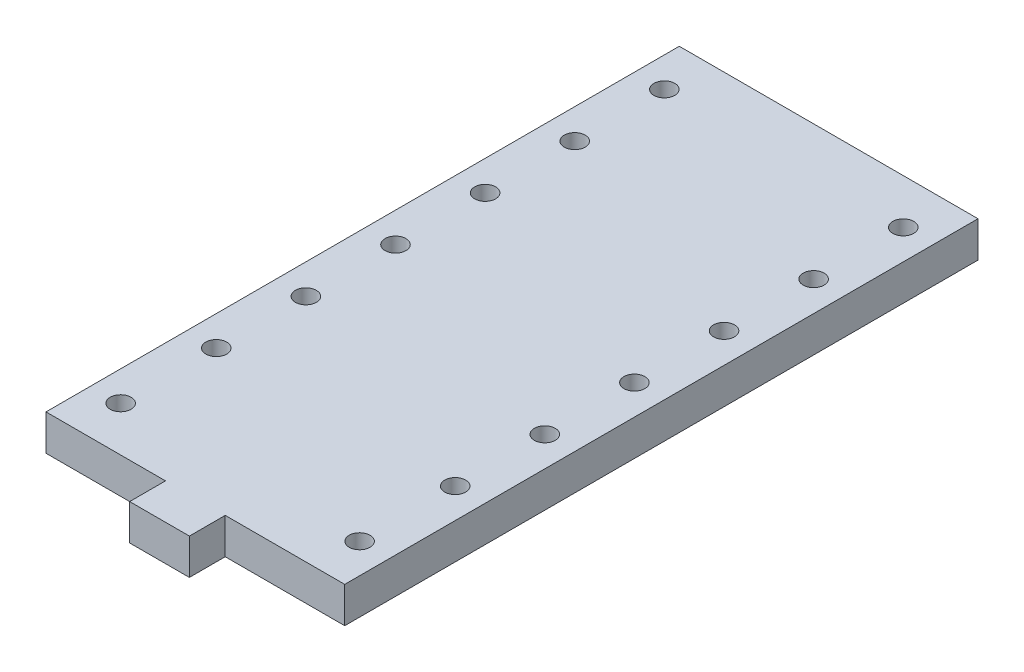
ISO-10303-21;
HEADER;
FILE_DESCRIPTION(('STEP AP214'),'2;1');
FILE_NAME('part.step','',(''),(''),'','','');
FILE_SCHEMA(('AUTOMOTIVE_DESIGN { 1 0 10303 214 1 1 1 1 }'));
ENDSEC;
DATA;
#1=APPLICATION_CONTEXT('core data for automotive mechanical design processes');
#2=APPLICATION_PROTOCOL_DEFINITION('international standard','automotive_design',2000,#1);
#3=PRODUCT_CONTEXT('',#1,'mechanical');
#4=PRODUCT('Part','Part','',(#3));
#5=PRODUCT_RELATED_PRODUCT_CATEGORY('part','',(#4));
#6=PRODUCT_DEFINITION_FORMATION('','',#4);
#7=PRODUCT_DEFINITION_CONTEXT('part definition',#1,'design');
#8=PRODUCT_DEFINITION('design','',#6,#7);
#9=PRODUCT_DEFINITION_SHAPE('','',#8);
#10=(LENGTH_UNIT() NAMED_UNIT(*) SI_UNIT(.MILLI.,.METRE.));
#11=(NAMED_UNIT(*) PLANE_ANGLE_UNIT() SI_UNIT($,.RADIAN.));
#12=(NAMED_UNIT(*) SI_UNIT($,.STERADIAN.) SOLID_ANGLE_UNIT());
#13=UNCERTAINTY_MEASURE_WITH_UNIT(LENGTH_MEASURE(1.E-05),#10,'distance_accuracy_value','');
#14=(GEOMETRIC_REPRESENTATION_CONTEXT(3) GLOBAL_UNCERTAINTY_ASSIGNED_CONTEXT((#13)) GLOBAL_UNIT_ASSIGNED_CONTEXT((#10,
#11,#12)) REPRESENTATION_CONTEXT('',''));
#15=CARTESIAN_POINT('',(0.,0.,0.));
#16=DIRECTION('',(0.,0.,1.));
#17=DIRECTION('',(1.,0.,0.));
#18=AXIS2_PLACEMENT_3D('',#15,#16,#17);
#19=CARTESIAN_POINT('',(-47.1360946745562,6.,0.));
#20=DIRECTION('',(1.,0.,0.));
#21=DIRECTION('',(0.,0.,-1.));
#22=AXIS2_PLACEMENT_3D('',#19,#20,#21);
#23=PLANE('',#22);
#24=DIRECTION('',(0.,-1.,0.));
#25=VECTOR('',#24,1.);
#26=CARTESIAN_POINT('',(-47.1360946745562,6.,-6.));
#27=LINE('',#26,#25);
#28=CARTESIAN_POINT('',(-47.1360946745562,6.,-6.));
#29=VERTEX_POINT('',#28);
#30=CARTESIAN_POINT('',(-47.1360946745562,0.,-6.));
#31=VERTEX_POINT('',#30);
#32=EDGE_CURVE('E63',#29,#31,#27,.T.);
#33=ORIENTED_EDGE('',*,*,#32,.F.);
#34=DIRECTION('',(0.,0.,1.));
#35=VECTOR('',#34,1.);
#36=CARTESIAN_POINT('',(-47.1360946745562,6.,0.));
#37=LINE('',#36,#35);
#38=CARTESIAN_POINT('',(-47.1360946745562,6.,-112.));
#39=VERTEX_POINT('',#38);
#40=EDGE_CURVE('E165',#39,#29,#37,.T.);
#41=ORIENTED_EDGE('',*,*,#40,.F.);
#42=DIRECTION('',(0.,-1.,0.));
#43=VECTOR('',#42,1.);
#44=CARTESIAN_POINT('',(-47.1360946745562,6.,-112.));
#45=LINE('',#44,#43);
#46=CARTESIAN_POINT('',(-47.1360946745562,0.,-112.));
#47=VERTEX_POINT('',#46);
#48=EDGE_CURVE('E48',#39,#47,#45,.T.);
#49=ORIENTED_EDGE('',*,*,#48,.T.);
#50=DIRECTION('',(0.,0.,1.));
#51=VECTOR('',#50,1.);
#52=CARTESIAN_POINT('',(-47.1360946745562,0.,0.));
#53=LINE('',#52,#51);
#54=EDGE_CURVE('E178',#47,#31,#53,.T.);
#55=ORIENTED_EDGE('',*,*,#54,.T.);
#56=EDGE_LOOP('',(#33,#41,#49,#55));
#57=FACE_BOUND('',#56,.T.);
#58=ADVANCED_FACE('F39',(#57),#23,.F.);
#59=CARTESIAN_POINT('',(2.86390532544378,6.,0.));
#60=DIRECTION('',(-1.,0.,0.));
#61=DIRECTION('',(0.,0.,1.));
#62=AXIS2_PLACEMENT_3D('',#59,#60,#61);
#63=PLANE('',#62);
#64=DIRECTION('',(0.,0.,-1.));
#65=VECTOR('',#64,1.);
#66=CARTESIAN_POINT('',(2.86390532544378,6.,0.));
#67=LINE('',#66,#65);
#68=CARTESIAN_POINT('',(2.86390532544378,6.,-6.));
#69=VERTEX_POINT('',#68);
#70=CARTESIAN_POINT('',(2.86390532544378,6.,-112.));
#71=VERTEX_POINT('',#70);
#72=EDGE_CURVE('E159',#69,#71,#67,.T.);
#73=ORIENTED_EDGE('',*,*,#72,.F.);
#74=DIRECTION('',(0.,1.,0.));
#75=VECTOR('',#74,1.);
#76=CARTESIAN_POINT('',(2.86390532544378,6.,-6.));
#77=LINE('',#76,#75);
#78=CARTESIAN_POINT('',(2.86390532544378,0.,-6.));
#79=VERTEX_POINT('',#78);
#80=EDGE_CURVE('E137',#79,#69,#77,.T.);
#81=ORIENTED_EDGE('',*,*,#80,.F.);
#82=DIRECTION('',(0.,0.,-1.));
#83=VECTOR('',#82,1.);
#84=CARTESIAN_POINT('',(2.86390532544378,0.,0.));
#85=LINE('',#84,#83);
#86=CARTESIAN_POINT('',(2.86390532544378,0.,-112.));
#87=VERTEX_POINT('',#86);
#88=EDGE_CURVE('E132',#79,#87,#85,.T.);
#89=ORIENTED_EDGE('',*,*,#88,.T.);
#90=DIRECTION('',(0.,-1.,0.));
#91=VECTOR('',#90,1.);
#92=CARTESIAN_POINT('',(2.86390532544378,6.,-112.));
#93=LINE('',#92,#91);
#94=EDGE_CURVE('E11',#71,#87,#93,.T.);
#95=ORIENTED_EDGE('',*,*,#94,.F.);
#96=EDGE_LOOP('',(#73,#81,#89,#95));
#97=FACE_BOUND('',#96,.T.);
#98=ADVANCED_FACE('F41',(#97),#63,.F.);
#99=CARTESIAN_POINT('',(2.86390532544378,6.,-112.));
#100=DIRECTION('',(0.,0.,1.));
#101=DIRECTION('',(1.,0.,0.));
#102=AXIS2_PLACEMENT_3D('',#99,#100,#101);
#103=PLANE('',#102);
#104=DIRECTION('',(-1.,0.,0.));
#105=VECTOR('',#104,1.);
#106=CARTESIAN_POINT('',(2.86390532544378,0.,-112.));
#107=LINE('',#106,#105);
#108=EDGE_CURVE('E175',#87,#47,#107,.T.);
#109=ORIENTED_EDGE('',*,*,#108,.T.);
#110=ORIENTED_EDGE('',*,*,#48,.F.);
#111=DIRECTION('',(-1.,0.,0.));
#112=VECTOR('',#111,1.);
#113=CARTESIAN_POINT('',(2.86390532544378,6.,-112.));
#114=LINE('',#113,#112);
#115=EDGE_CURVE('E162',#71,#39,#114,.T.);
#116=ORIENTED_EDGE('',*,*,#115,.F.);
#117=ORIENTED_EDGE('',*,*,#94,.T.);
#118=EDGE_LOOP('',(#109,#110,#116,#117));
#119=FACE_BOUND('',#118,.T.);
#120=ADVANCED_FACE('F193',(#119),#103,.F.);
#121=CARTESIAN_POINT('',(2.86390532544378,6.,0.));
#122=DIRECTION('',(0.,0.,-1.));
#123=DIRECTION('',(-1.,0.,0.));
#124=AXIS2_PLACEMENT_3D('',#121,#122,#123);
#125=PLANE('',#124);
#126=DIRECTION('',(1.,0.,0.));
#127=VECTOR('',#126,1.);
#128=CARTESIAN_POINT('',(2.86390532544378,6.,0.));
#129=LINE('',#128,#127);
#130=CARTESIAN_POINT('',(-27.1360946745562,6.,0.));
#131=VERTEX_POINT('',#130);
#132=CARTESIAN_POINT('',(-17.1360946745562,6.,0.));
#133=VERTEX_POINT('',#132);
#134=EDGE_CURVE('E169',#131,#133,#129,.T.);
#135=ORIENTED_EDGE('',*,*,#134,.F.);
#136=DIRECTION('',(0.,1.,0.));
#137=VECTOR('',#136,1.);
#138=CARTESIAN_POINT('',(-27.1360946745562,6.,0.));
#139=LINE('',#138,#137);
#140=CARTESIAN_POINT('',(-27.1360946745562,0.,0.));
#141=VERTEX_POINT('',#140);
#142=EDGE_CURVE('E156',#141,#131,#139,.T.);
#143=ORIENTED_EDGE('',*,*,#142,.F.);
#144=DIRECTION('',(1.,0.,0.));
#145=VECTOR('',#144,1.);
#146=CARTESIAN_POINT('',(2.86390532544378,0.,0.));
#147=LINE('',#146,#145);
#148=CARTESIAN_POINT('',(-17.1360946745562,0.,0.));
#149=VERTEX_POINT('',#148);
#150=EDGE_CURVE('E127',#141,#149,#147,.T.);
#151=ORIENTED_EDGE('',*,*,#150,.T.);
#152=DIRECTION('',(0.,-1.,0.));
#153=VECTOR('',#152,1.);
#154=CARTESIAN_POINT('',(-17.1360946745562,6.,0.));
#155=LINE('',#154,#153);
#156=EDGE_CURVE('E141',#133,#149,#155,.T.);
#157=ORIENTED_EDGE('',*,*,#156,.F.);
#158=EDGE_LOOP('',(#135,#143,#151,#157));
#159=FACE_BOUND('',#158,.T.);
#160=ADVANCED_FACE('F207',(#159),#125,.F.);
#161=CARTESIAN_POINT('',(0.,6.,0.));
#162=DIRECTION('',(0.,1.,0.));
#163=DIRECTION('',(0.,0.,1.));
#164=AXIS2_PLACEMENT_3D('',#161,#162,#163);
#165=PLANE('',#164);
#166=CARTESIAN_POINT('',(-42.1360946745562,6.,-74.5));
#167=DIRECTION('',(0.,1.,0.));
#168=DIRECTION('',(0.,0.,1.));
#169=AXIS2_PLACEMENT_3D('',#166,#167,#168);
#170=CIRCLE('',#169,1.75);
#171=CARTESIAN_POINT('',(-42.1360946745562,6.,-72.75));
#172=VERTEX_POINT('',#171);
#173=EDGE_CURVE('E253',#172,#172,#170,.T.);
#174=ORIENTED_EDGE('',*,*,#173,.F.);
#175=EDGE_LOOP('',(#174));
#176=FACE_BOUND('',#175,.T.);
#177=CARTESIAN_POINT('',(-42.1360946745562,6.,-89.5));
#178=DIRECTION('',(0.,1.,0.));
#179=DIRECTION('',(0.,0.,1.));
#180=AXIS2_PLACEMENT_3D('',#177,#178,#179);
#181=CIRCLE('',#180,1.75);
#182=CARTESIAN_POINT('',(-42.1360946745562,6.,-87.75));
#183=VERTEX_POINT('',#182);
#184=EDGE_CURVE('E277',#183,#183,#181,.T.);
#185=ORIENTED_EDGE('',*,*,#184,.F.);
#186=EDGE_LOOP('',(#185));
#187=FACE_BOUND('',#186,.T.);
#188=CARTESIAN_POINT('',(-42.1360946745562,6.,-104.5));
#189=DIRECTION('',(0.,1.,0.));
#190=DIRECTION('',(0.,0.,1.));
#191=AXIS2_PLACEMENT_3D('',#188,#189,#190);
#192=CIRCLE('',#191,1.75);
#193=CARTESIAN_POINT('',(-42.1360946745562,6.,-102.75));
#194=VERTEX_POINT('',#193);
#195=EDGE_CURVE('E254',#194,#194,#192,.T.);
#196=ORIENTED_EDGE('',*,*,#195,.F.);
#197=EDGE_LOOP('',(#196));
#198=FACE_BOUND('',#197,.T.);
#199=CARTESIAN_POINT('',(-2.13609467455621,6.,-89.4917253959785));
#200=DIRECTION('',(0.,1.,0.));
#201=DIRECTION('',(0.,0.,1.));
#202=AXIS2_PLACEMENT_3D('',#199,#200,#201);
#203=CIRCLE('',#202,1.75);
#204=CARTESIAN_POINT('',(-2.13609467455621,6.,-87.7417253959785));
#205=VERTEX_POINT('',#204);
#206=EDGE_CURVE('E263',#205,#205,#203,.T.);
#207=ORIENTED_EDGE('',*,*,#206,.F.);
#208=EDGE_LOOP('',(#207));
#209=FACE_BOUND('',#208,.T.);
#210=CARTESIAN_POINT('',(-42.1360946745562,6.,-59.5));
#211=DIRECTION('',(0.,1.,0.));
#212=DIRECTION('',(0.,0.,1.));
#213=AXIS2_PLACEMENT_3D('',#210,#211,#212);
#214=CIRCLE('',#213,1.75);
#215=CARTESIAN_POINT('',(-42.1360946745562,6.,-57.75));
#216=VERTEX_POINT('',#215);
#217=EDGE_CURVE('E245',#216,#216,#214,.T.);
#218=ORIENTED_EDGE('',*,*,#217,.F.);
#219=EDGE_LOOP('',(#218));
#220=FACE_BOUND('',#219,.T.);
#221=CARTESIAN_POINT('',(-42.1360946745562,6.,-44.5));
#222=DIRECTION('',(0.,1.,0.));
#223=DIRECTION('',(0.,0.,1.));
#224=AXIS2_PLACEMENT_3D('',#221,#222,#223);
#225=CIRCLE('',#224,1.75);
#226=CARTESIAN_POINT('',(-42.1360946745562,6.,-42.75));
#227=VERTEX_POINT('',#226);
#228=EDGE_CURVE('E237',#227,#227,#225,.T.);
#229=ORIENTED_EDGE('',*,*,#228,.F.);
#230=EDGE_LOOP('',(#229));
#231=FACE_BOUND('',#230,.T.);
#232=CARTESIAN_POINT('',(-42.1360946745562,6.,-13.5));
#233=DIRECTION('',(0.,1.,0.));
#234=DIRECTION('',(0.,0.,1.));
#235=AXIS2_PLACEMENT_3D('',#232,#233,#234);
#236=CIRCLE('',#235,1.75);
#237=CARTESIAN_POINT('',(-42.1360946745562,6.,-11.75));
#238=VERTEX_POINT('',#237);
#239=EDGE_CURVE('E229',#238,#238,#236,.T.);
#240=ORIENTED_EDGE('',*,*,#239,.F.);
#241=EDGE_LOOP('',(#240));
#242=FACE_BOUND('',#241,.T.);
#243=CARTESIAN_POINT('',(-42.1360946745562,6.,-29.5));
#244=DIRECTION('',(0.,1.,0.));
#245=DIRECTION('',(0.,0.,1.));
#246=AXIS2_PLACEMENT_3D('',#243,#244,#245);
#247=CIRCLE('',#246,1.75);
#248=CARTESIAN_POINT('',(-42.1360946745562,6.,-27.75));
#249=VERTEX_POINT('',#248);
#250=EDGE_CURVE('E220',#249,#249,#247,.T.);
#251=ORIENTED_EDGE('',*,*,#250,.F.);
#252=EDGE_LOOP('',(#251));
#253=FACE_BOUND('',#252,.T.);
#254=CARTESIAN_POINT('',(-2.13609467455621,6.,-29.4917253959785));
#255=DIRECTION('',(0.,1.,0.));
#256=DIRECTION('',(0.,0.,1.));
#257=AXIS2_PLACEMENT_3D('',#254,#255,#256);
#258=CIRCLE('',#257,1.75);
#259=CARTESIAN_POINT('',(-2.13609467455621,6.,-27.7417253959785));
#260=VERTEX_POINT('',#259);
#261=EDGE_CURVE('E316',#260,#260,#258,.T.);
#262=ORIENTED_EDGE('',*,*,#261,.F.);
#263=EDGE_LOOP('',(#262));
#264=FACE_BOUND('',#263,.T.);
#265=CARTESIAN_POINT('',(-2.1360946745562,6.,-13.4917253959785));
#266=DIRECTION('',(0.,1.,0.));
#267=DIRECTION('',(0.,0.,1.));
#268=AXIS2_PLACEMENT_3D('',#265,#266,#267);
#269=CIRCLE('',#268,1.75);
#270=CARTESIAN_POINT('',(-2.1360946745562,6.,-11.7417253959785));
#271=VERTEX_POINT('',#270);
#272=EDGE_CURVE('E284',#271,#271,#269,.T.);
#273=ORIENTED_EDGE('',*,*,#272,.F.);
#274=EDGE_LOOP('',(#273));
#275=FACE_BOUND('',#274,.T.);
#276=CARTESIAN_POINT('',(-2.13609467455621,6.,-44.4917253959785));
#277=DIRECTION('',(0.,1.,0.));
#278=DIRECTION('',(0.,0.,1.));
#279=AXIS2_PLACEMENT_3D('',#276,#277,#278);
#280=CIRCLE('',#279,1.75);
#281=CARTESIAN_POINT('',(-2.13609467455621,6.,-42.7417253959785));
#282=VERTEX_POINT('',#281);
#283=EDGE_CURVE('E293',#282,#282,#280,.T.);
#284=ORIENTED_EDGE('',*,*,#283,.F.);
#285=EDGE_LOOP('',(#284));
#286=FACE_BOUND('',#285,.T.);
#287=CARTESIAN_POINT('',(-2.13609467455621,6.,-59.4917253959785));
#288=DIRECTION('',(0.,1.,0.));
#289=DIRECTION('',(0.,0.,1.));
#290=AXIS2_PLACEMENT_3D('',#287,#288,#289);
#291=CIRCLE('',#290,1.75);
#292=CARTESIAN_POINT('',(-2.13609467455621,6.,-57.7417253959785));
#293=VERTEX_POINT('',#292);
#294=EDGE_CURVE('E301',#293,#293,#291,.T.);
#295=ORIENTED_EDGE('',*,*,#294,.F.);
#296=EDGE_LOOP('',(#295));
#297=FACE_BOUND('',#296,.T.);
#298=CARTESIAN_POINT('',(-2.13609467455621,6.,-74.4917253959785));
#299=DIRECTION('',(0.,1.,0.));
#300=DIRECTION('',(0.,0.,1.));
#301=AXIS2_PLACEMENT_3D('',#298,#299,#300);
#302=CIRCLE('',#301,1.75);
#303=CARTESIAN_POINT('',(-2.13609467455621,6.,-72.7417253959785));
#304=VERTEX_POINT('',#303);
#305=EDGE_CURVE('E309',#304,#304,#302,.T.);
#306=ORIENTED_EDGE('',*,*,#305,.F.);
#307=EDGE_LOOP('',(#306));
#308=FACE_BOUND('',#307,.T.);
#309=CARTESIAN_POINT('',(-2.13609467455621,6.,-104.491725395979));
#310=DIRECTION('',(0.,1.,0.));
#311=DIRECTION('',(0.,0.,1.));
#312=AXIS2_PLACEMENT_3D('',#309,#310,#311);
#313=CIRCLE('',#312,1.75);
#314=CARTESIAN_POINT('',(-2.13609467455621,6.,-102.741725395979));
#315=VERTEX_POINT('',#314);
#316=EDGE_CURVE('E212',#315,#315,#313,.T.);
#317=ORIENTED_EDGE('',*,*,#316,.F.);
#318=EDGE_LOOP('',(#317));
#319=FACE_BOUND('',#318,.T.);
#320=DIRECTION('',(0.,0.,1.));
#321=VECTOR('',#320,1.);
#322=CARTESIAN_POINT('',(-27.1360946745562,6.,-6.));
#323=LINE('',#322,#321);
#324=CARTESIAN_POINT('',(-27.1360946745562,6.,-6.));
#325=VERTEX_POINT('',#324);
#326=EDGE_CURVE('E111',#325,#131,#323,.T.);
#327=ORIENTED_EDGE('',*,*,#326,.T.);
#328=ORIENTED_EDGE('',*,*,#134,.T.);
#329=DIRECTION('',(0.,0.,1.));
#330=VECTOR('',#329,1.);
#331=CARTESIAN_POINT('',(-17.1360946745562,6.,-6.));
#332=LINE('',#331,#330);
#333=CARTESIAN_POINT('',(-17.1360946745562,6.,-6.));
#334=VERTEX_POINT('',#333);
#335=EDGE_CURVE('E149',#334,#133,#332,.T.);
#336=ORIENTED_EDGE('',*,*,#335,.F.);
#337=DIRECTION('',(-1.,0.,0.));
#338=VECTOR('',#337,1.);
#339=CARTESIAN_POINT('',(2.86390532544378,6.,-6.));
#340=LINE('',#339,#338);
#341=EDGE_CURVE('E140',#69,#334,#340,.T.);
#342=ORIENTED_EDGE('',*,*,#341,.F.);
#343=ORIENTED_EDGE('',*,*,#72,.T.);
#344=ORIENTED_EDGE('',*,*,#115,.T.);
#345=ORIENTED_EDGE('',*,*,#40,.T.);
#346=DIRECTION('',(-1.,0.,0.));
#347=VECTOR('',#346,1.);
#348=CARTESIAN_POINT('',(-47.1360946745562,6.,-6.));
#349=LINE('',#348,#347);
#350=EDGE_CURVE('E114',#325,#29,#349,.T.);
#351=ORIENTED_EDGE('',*,*,#350,.F.);
#352=EDGE_LOOP('',(#327,#328,#336,#342,#343,#344,#345,#351));
#353=FACE_BOUND('',#352,.T.);
#354=ADVANCED_FACE('F201',(#176,#187,#198,#209,#220,#231,#242,#253,#264,#275,#286,#297,#308,
#319,#353),#165,.T.);
#355=CARTESIAN_POINT('',(0.,0.,0.));
#356=DIRECTION('',(0.,1.,0.));
#357=DIRECTION('',(0.,0.,1.));
#358=AXIS2_PLACEMENT_3D('',#355,#356,#357);
#359=PLANE('',#358);
#360=CARTESIAN_POINT('',(-42.1360946745562,0.,-74.5));
#361=DIRECTION('',(0.,1.,0.));
#362=DIRECTION('',(0.,0.,1.));
#363=AXIS2_PLACEMENT_3D('',#360,#361,#362);
#364=CIRCLE('',#363,1.75);
#365=CARTESIAN_POINT('',(-42.1360946745562,0.,-72.75));
#366=VERTEX_POINT('',#365);
#367=EDGE_CURVE('E273',#366,#366,#364,.T.);
#368=ORIENTED_EDGE('',*,*,#367,.T.);
#369=EDGE_LOOP('',(#368));
#370=FACE_BOUND('',#369,.T.);
#371=CARTESIAN_POINT('',(-42.1360946745562,0.,-89.5));
#372=DIRECTION('',(0.,1.,0.));
#373=DIRECTION('',(0.,0.,1.));
#374=AXIS2_PLACEMENT_3D('',#371,#372,#373);
#375=CIRCLE('',#374,1.75);
#376=CARTESIAN_POINT('',(-42.1360946745562,0.,-87.75));
#377=VERTEX_POINT('',#376);
#378=EDGE_CURVE('E259',#377,#377,#375,.T.);
#379=ORIENTED_EDGE('',*,*,#378,.T.);
#380=EDGE_LOOP('',(#379));
#381=FACE_BOUND('',#380,.T.);
#382=CARTESIAN_POINT('',(-42.1360946745562,0.,-104.5));
#383=DIRECTION('',(0.,1.,0.));
#384=DIRECTION('',(0.,0.,1.));
#385=AXIS2_PLACEMENT_3D('',#382,#383,#384);
#386=CIRCLE('',#385,1.75);
#387=CARTESIAN_POINT('',(-42.1360946745562,0.,-102.75));
#388=VERTEX_POINT('',#387);
#389=EDGE_CURVE('E258',#388,#388,#386,.T.);
#390=ORIENTED_EDGE('',*,*,#389,.T.);
#391=EDGE_LOOP('',(#390));
#392=FACE_BOUND('',#391,.T.);
#393=CARTESIAN_POINT('',(-2.13609467455621,0.,-89.4917253959785));
#394=DIRECTION('',(0.,1.,0.));
#395=DIRECTION('',(0.,0.,1.));
#396=AXIS2_PLACEMENT_3D('',#393,#394,#395);
#397=CIRCLE('',#396,1.75);
#398=CARTESIAN_POINT('',(-2.13609467455621,0.,-87.7417253959785));
#399=VERTEX_POINT('',#398);
#400=EDGE_CURVE('E216',#399,#399,#397,.T.);
#401=ORIENTED_EDGE('',*,*,#400,.T.);
#402=EDGE_LOOP('',(#401));
#403=FACE_BOUND('',#402,.T.);
#404=CARTESIAN_POINT('',(-42.1360946745562,0.,-59.5));
#405=DIRECTION('',(0.,1.,0.));
#406=DIRECTION('',(0.,0.,1.));
#407=AXIS2_PLACEMENT_3D('',#404,#405,#406);
#408=CIRCLE('',#407,1.75);
#409=CARTESIAN_POINT('',(-42.1360946745562,0.,-57.75));
#410=VERTEX_POINT('',#409);
#411=EDGE_CURVE('E249',#410,#410,#408,.T.);
#412=ORIENTED_EDGE('',*,*,#411,.T.);
#413=EDGE_LOOP('',(#412));
#414=FACE_BOUND('',#413,.T.);
#415=CARTESIAN_POINT('',(-42.1360946745562,0.,-44.5));
#416=DIRECTION('',(0.,1.,0.));
#417=DIRECTION('',(0.,0.,1.));
#418=AXIS2_PLACEMENT_3D('',#415,#416,#417);
#419=CIRCLE('',#418,1.75);
#420=CARTESIAN_POINT('',(-42.1360946745562,0.,-42.75));
#421=VERTEX_POINT('',#420);
#422=EDGE_CURVE('E241',#421,#421,#419,.T.);
#423=ORIENTED_EDGE('',*,*,#422,.T.);
#424=EDGE_LOOP('',(#423));
#425=FACE_BOUND('',#424,.T.);
#426=CARTESIAN_POINT('',(-42.1360946745562,0.,-13.5));
#427=DIRECTION('',(0.,1.,0.));
#428=DIRECTION('',(0.,0.,1.));
#429=AXIS2_PLACEMENT_3D('',#426,#427,#428);
#430=CIRCLE('',#429,1.75);
#431=CARTESIAN_POINT('',(-42.1360946745562,0.,-11.75));
#432=VERTEX_POINT('',#431);
#433=EDGE_CURVE('E233',#432,#432,#430,.T.);
#434=ORIENTED_EDGE('',*,*,#433,.T.);
#435=EDGE_LOOP('',(#434));
#436=FACE_BOUND('',#435,.T.);
#437=CARTESIAN_POINT('',(-42.1360946745562,0.,-29.5));
#438=DIRECTION('',(0.,1.,0.));
#439=DIRECTION('',(0.,0.,1.));
#440=AXIS2_PLACEMENT_3D('',#437,#438,#439);
#441=CIRCLE('',#440,1.75);
#442=CARTESIAN_POINT('',(-42.1360946745562,0.,-27.75));
#443=VERTEX_POINT('',#442);
#444=EDGE_CURVE('E224',#443,#443,#441,.T.);
#445=ORIENTED_EDGE('',*,*,#444,.T.);
#446=EDGE_LOOP('',(#445));
#447=FACE_BOUND('',#446,.T.);
#448=CARTESIAN_POINT('',(-2.13609467455621,0.,-29.4917253959785));
#449=DIRECTION('',(0.,1.,0.));
#450=DIRECTION('',(0.,0.,1.));
#451=AXIS2_PLACEMENT_3D('',#448,#449,#450);
#452=CIRCLE('',#451,1.75);
#453=CARTESIAN_POINT('',(-2.13609467455621,0.,-27.7417253959785));
#454=VERTEX_POINT('',#453);
#455=EDGE_CURVE('E289',#454,#454,#452,.T.);
#456=ORIENTED_EDGE('',*,*,#455,.T.);
#457=EDGE_LOOP('',(#456));
#458=FACE_BOUND('',#457,.T.);
#459=CARTESIAN_POINT('',(-2.1360946745562,0.,-13.4917253959785));
#460=DIRECTION('',(0.,1.,0.));
#461=DIRECTION('',(0.,0.,1.));
#462=AXIS2_PLACEMENT_3D('',#459,#460,#461);
#463=CIRCLE('',#462,1.75);
#464=CARTESIAN_POINT('',(-2.1360946745562,0.,-11.7417253959785));
#465=VERTEX_POINT('',#464);
#466=EDGE_CURVE('E288',#465,#465,#463,.T.);
#467=ORIENTED_EDGE('',*,*,#466,.T.);
#468=EDGE_LOOP('',(#467));
#469=FACE_BOUND('',#468,.T.);
#470=CARTESIAN_POINT('',(-2.13609467455621,0.,-44.4917253959785));
#471=DIRECTION('',(0.,1.,0.));
#472=DIRECTION('',(0.,0.,1.));
#473=AXIS2_PLACEMENT_3D('',#470,#471,#472);
#474=CIRCLE('',#473,1.75);
#475=CARTESIAN_POINT('',(-2.13609467455621,0.,-42.7417253959785));
#476=VERTEX_POINT('',#475);
#477=EDGE_CURVE('E297',#476,#476,#474,.T.);
#478=ORIENTED_EDGE('',*,*,#477,.T.);
#479=EDGE_LOOP('',(#478));
#480=FACE_BOUND('',#479,.T.);
#481=CARTESIAN_POINT('',(-2.13609467455621,0.,-59.4917253959785));
#482=DIRECTION('',(0.,1.,0.));
#483=DIRECTION('',(0.,0.,1.));
#484=AXIS2_PLACEMENT_3D('',#481,#482,#483);
#485=CIRCLE('',#484,1.75);
#486=CARTESIAN_POINT('',(-2.13609467455621,0.,-57.7417253959785));
#487=VERTEX_POINT('',#486);
#488=EDGE_CURVE('E305',#487,#487,#485,.T.);
#489=ORIENTED_EDGE('',*,*,#488,.T.);
#490=EDGE_LOOP('',(#489));
#491=FACE_BOUND('',#490,.T.);
#492=CARTESIAN_POINT('',(-2.13609467455621,0.,-74.4917253959785));
#493=DIRECTION('',(0.,1.,0.));
#494=DIRECTION('',(0.,0.,1.));
#495=AXIS2_PLACEMENT_3D('',#492,#493,#494);
#496=CIRCLE('',#495,1.75);
#497=CARTESIAN_POINT('',(-2.13609467455621,0.,-72.7417253959785));
#498=VERTEX_POINT('',#497);
#499=EDGE_CURVE('E225',#498,#498,#496,.T.);
#500=ORIENTED_EDGE('',*,*,#499,.T.);
#501=EDGE_LOOP('',(#500));
#502=FACE_BOUND('',#501,.T.);
#503=CARTESIAN_POINT('',(-2.13609467455621,0.,-104.491725395979));
#504=DIRECTION('',(0.,1.,0.));
#505=DIRECTION('',(0.,0.,1.));
#506=AXIS2_PLACEMENT_3D('',#503,#504,#505);
#507=CIRCLE('',#506,1.75);
#508=CARTESIAN_POINT('',(-2.13609467455621,0.,-102.741725395979));
#509=VERTEX_POINT('',#508);
#510=EDGE_CURVE('E152',#509,#509,#507,.T.);
#511=ORIENTED_EDGE('',*,*,#510,.T.);
#512=EDGE_LOOP('',(#511));
#513=FACE_BOUND('',#512,.T.);
#514=ORIENTED_EDGE('',*,*,#150,.F.);
#515=DIRECTION('',(0.,0.,1.));
#516=VECTOR('',#515,1.);
#517=CARTESIAN_POINT('',(-27.1360946745562,0.,-6.));
#518=LINE('',#517,#516);
#519=CARTESIAN_POINT('',(-27.1360946745562,0.,-6.));
#520=VERTEX_POINT('',#519);
#521=EDGE_CURVE('E108',#520,#141,#518,.T.);
#522=ORIENTED_EDGE('',*,*,#521,.F.);
#523=DIRECTION('',(1.,0.,0.));
#524=VECTOR('',#523,1.);
#525=CARTESIAN_POINT('',(-47.1360946745562,0.,-6.));
#526=LINE('',#525,#524);
#527=EDGE_CURVE('E115',#31,#520,#526,.T.);
#528=ORIENTED_EDGE('',*,*,#527,.F.);
#529=ORIENTED_EDGE('',*,*,#54,.F.);
#530=ORIENTED_EDGE('',*,*,#108,.F.);
#531=ORIENTED_EDGE('',*,*,#88,.F.);
#532=DIRECTION('',(1.,0.,0.));
#533=VECTOR('',#532,1.);
#534=CARTESIAN_POINT('',(2.86390532544378,0.,-6.));
#535=LINE('',#534,#533);
#536=CARTESIAN_POINT('',(-17.1360946745562,0.,-6.));
#537=VERTEX_POINT('',#536);
#538=EDGE_CURVE('E146',#537,#79,#535,.T.);
#539=ORIENTED_EDGE('',*,*,#538,.F.);
#540=DIRECTION('',(0.,0.,1.));
#541=VECTOR('',#540,1.);
#542=CARTESIAN_POINT('',(-17.1360946745562,0.,-6.));
#543=LINE('',#542,#541);
#544=EDGE_CURVE('E153',#537,#149,#543,.T.);
#545=ORIENTED_EDGE('',*,*,#544,.T.);
#546=EDGE_LOOP('',(#514,#522,#528,#529,#530,#531,#539,#545));
#547=FACE_BOUND('',#546,.T.);
#548=ADVANCED_FACE('F124',(#370,#381,#392,#403,#414,#425,#436,#447,#458,#469,#480,#491,#502,
#513,#547),#359,.F.);
#549=CARTESIAN_POINT('',(-17.1360946745562,6.,-6.));
#550=DIRECTION('',(-1.,0.,0.));
#551=DIRECTION('',(0.,0.,1.));
#552=AXIS2_PLACEMENT_3D('',#549,#550,#551);
#553=PLANE('',#552);
#554=ORIENTED_EDGE('',*,*,#156,.T.);
#555=ORIENTED_EDGE('',*,*,#544,.F.);
#556=DIRECTION('',(0.,-1.,0.));
#557=VECTOR('',#556,1.);
#558=CARTESIAN_POINT('',(-17.1360946745562,6.,-6.));
#559=LINE('',#558,#557);
#560=EDGE_CURVE('E55',#334,#537,#559,.T.);
#561=ORIENTED_EDGE('',*,*,#560,.F.);
#562=ORIENTED_EDGE('',*,*,#335,.T.);
#563=EDGE_LOOP('',(#554,#555,#561,#562));
#564=FACE_BOUND('',#563,.T.);
#565=ADVANCED_FACE('F205',(#564),#553,.F.);
#566=CARTESIAN_POINT('',(0.,0.,-6.));
#567=DIRECTION('',(0.,0.,-1.));
#568=DIRECTION('',(-1.,0.,0.));
#569=AXIS2_PLACEMENT_3D('',#566,#567,#568);
#570=PLANE('',#569);
#571=ORIENTED_EDGE('',*,*,#80,.T.);
#572=ORIENTED_EDGE('',*,*,#341,.T.);
#573=ORIENTED_EDGE('',*,*,#560,.T.);
#574=ORIENTED_EDGE('',*,*,#538,.T.);
#575=EDGE_LOOP('',(#571,#572,#573,#574));
#576=FACE_BOUND('',#575,.T.);
#577=ADVANCED_FACE('F198',(#576),#570,.F.);
#578=CARTESIAN_POINT('',(-27.1360946745562,6.,-6.));
#579=DIRECTION('',(1.,0.,0.));
#580=DIRECTION('',(0.,0.,-1.));
#581=AXIS2_PLACEMENT_3D('',#578,#579,#580);
#582=PLANE('',#581);
#583=ORIENTED_EDGE('',*,*,#142,.T.);
#584=ORIENTED_EDGE('',*,*,#326,.F.);
#585=DIRECTION('',(0.,1.,0.));
#586=VECTOR('',#585,1.);
#587=CARTESIAN_POINT('',(-27.1360946745562,6.,-6.));
#588=LINE('',#587,#586);
#589=EDGE_CURVE('E105',#520,#325,#588,.T.);
#590=ORIENTED_EDGE('',*,*,#589,.F.);
#591=ORIENTED_EDGE('',*,*,#521,.T.);
#592=EDGE_LOOP('',(#583,#584,#590,#591));
#593=FACE_BOUND('',#592,.T.);
#594=ADVANCED_FACE('F106',(#593),#582,.F.);
#595=CARTESIAN_POINT('',(0.,0.,-6.));
#596=DIRECTION('',(0.,0.,1.));
#597=DIRECTION('',(1.,0.,0.));
#598=AXIS2_PLACEMENT_3D('',#595,#596,#597);
#599=PLANE('',#598);
#600=ORIENTED_EDGE('',*,*,#32,.T.);
#601=ORIENTED_EDGE('',*,*,#527,.T.);
#602=ORIENTED_EDGE('',*,*,#589,.T.);
#603=ORIENTED_EDGE('',*,*,#350,.T.);
#604=EDGE_LOOP('',(#600,#601,#602,#603));
#605=FACE_BOUND('',#604,.T.);
#606=ADVANCED_FACE('F117',(#605),#599,.T.);
#607=CARTESIAN_POINT('',(-2.13609467455621,0.,-104.491725395979));
#608=DIRECTION('',(0.,1.,0.));
#609=DIRECTION('',(0.,0.,1.));
#610=AXIS2_PLACEMENT_3D('',#607,#608,#609);
#611=CYLINDRICAL_SURFACE('',#610,1.75);
#612=ORIENTED_EDGE('',*,*,#510,.F.);
#613=EDGE_LOOP('',(#612));
#614=FACE_BOUND('',#613,.T.);
#615=ORIENTED_EDGE('',*,*,#316,.T.);
#616=EDGE_LOOP('',(#615));
#617=FACE_BOUND('',#616,.T.);
#618=ADVANCED_FACE('F348',(#614,#617),#611,.F.);
#619=CARTESIAN_POINT('',(-2.13609467455621,0.,-74.4917253959785));
#620=DIRECTION('',(0.,1.,0.));
#621=DIRECTION('',(0.,0.,1.));
#622=AXIS2_PLACEMENT_3D('',#619,#620,#621);
#623=CYLINDRICAL_SURFACE('',#622,1.75);
#624=ORIENTED_EDGE('',*,*,#499,.F.);
#625=EDGE_LOOP('',(#624));
#626=FACE_BOUND('',#625,.T.);
#627=ORIENTED_EDGE('',*,*,#305,.T.);
#628=EDGE_LOOP('',(#627));
#629=FACE_BOUND('',#628,.T.);
#630=ADVANCED_FACE('F350',(#626,#629),#623,.F.);
#631=CARTESIAN_POINT('',(-2.13609467455621,0.,-59.4917253959785));
#632=DIRECTION('',(0.,1.,0.));
#633=DIRECTION('',(0.,0.,1.));
#634=AXIS2_PLACEMENT_3D('',#631,#632,#633);
#635=CYLINDRICAL_SURFACE('',#634,1.75);
#636=ORIENTED_EDGE('',*,*,#488,.F.);
#637=EDGE_LOOP('',(#636));
#638=FACE_BOUND('',#637,.T.);
#639=ORIENTED_EDGE('',*,*,#294,.T.);
#640=EDGE_LOOP('',(#639));
#641=FACE_BOUND('',#640,.T.);
#642=ADVANCED_FACE('F357',(#638,#641),#635,.F.);
#643=CARTESIAN_POINT('',(-2.13609467455621,0.,-44.4917253959785));
#644=DIRECTION('',(0.,1.,0.));
#645=DIRECTION('',(0.,0.,1.));
#646=AXIS2_PLACEMENT_3D('',#643,#644,#645);
#647=CYLINDRICAL_SURFACE('',#646,1.75);
#648=ORIENTED_EDGE('',*,*,#477,.F.);
#649=EDGE_LOOP('',(#648));
#650=FACE_BOUND('',#649,.T.);
#651=ORIENTED_EDGE('',*,*,#283,.T.);
#652=EDGE_LOOP('',(#651));
#653=FACE_BOUND('',#652,.T.);
#654=ADVANCED_FACE('F430',(#650,#653),#647,.F.);
#655=CARTESIAN_POINT('',(-2.1360946745562,0.,-13.4917253959785));
#656=DIRECTION('',(0.,1.,0.));
#657=DIRECTION('',(0.,0.,1.));
#658=AXIS2_PLACEMENT_3D('',#655,#656,#657);
#659=CYLINDRICAL_SURFACE('',#658,1.75);
#660=ORIENTED_EDGE('',*,*,#466,.F.);
#661=EDGE_LOOP('',(#660));
#662=FACE_BOUND('',#661,.T.);
#663=ORIENTED_EDGE('',*,*,#272,.T.);
#664=EDGE_LOOP('',(#663));
#665=FACE_BOUND('',#664,.T.);
#666=ADVANCED_FACE('F330',(#662,#665),#659,.F.);
#667=CARTESIAN_POINT('',(-2.13609467455621,0.,-29.4917253959785));
#668=DIRECTION('',(0.,1.,0.));
#669=DIRECTION('',(0.,0.,1.));
#670=AXIS2_PLACEMENT_3D('',#667,#668,#669);
#671=CYLINDRICAL_SURFACE('',#670,1.75);
#672=ORIENTED_EDGE('',*,*,#455,.F.);
#673=EDGE_LOOP('',(#672));
#674=FACE_BOUND('',#673,.T.);
#675=ORIENTED_EDGE('',*,*,#261,.T.);
#676=EDGE_LOOP('',(#675));
#677=FACE_BOUND('',#676,.T.);
#678=ADVANCED_FACE('F326',(#674,#677),#671,.F.);
#679=CARTESIAN_POINT('',(-42.1360946745562,0.,-29.5));
#680=DIRECTION('',(0.,1.,0.));
#681=DIRECTION('',(0.,0.,1.));
#682=AXIS2_PLACEMENT_3D('',#679,#680,#681);
#683=CYLINDRICAL_SURFACE('',#682,1.75);
#684=ORIENTED_EDGE('',*,*,#444,.F.);
#685=EDGE_LOOP('',(#684));
#686=FACE_BOUND('',#685,.T.);
#687=ORIENTED_EDGE('',*,*,#250,.T.);
#688=EDGE_LOOP('',(#687));
#689=FACE_BOUND('',#688,.T.);
#690=ADVANCED_FACE('F329',(#686,#689),#683,.F.);
#691=CARTESIAN_POINT('',(-42.1360946745562,0.,-13.5));
#692=DIRECTION('',(0.,1.,0.));
#693=DIRECTION('',(0.,0.,1.));
#694=AXIS2_PLACEMENT_3D('',#691,#692,#693);
#695=CYLINDRICAL_SURFACE('',#694,1.75);
#696=ORIENTED_EDGE('',*,*,#433,.F.);
#697=EDGE_LOOP('',(#696));
#698=FACE_BOUND('',#697,.T.);
#699=ORIENTED_EDGE('',*,*,#239,.T.);
#700=EDGE_LOOP('',(#699));
#701=FACE_BOUND('',#700,.T.);
#702=ADVANCED_FACE('F460',(#698,#701),#695,.F.);
#703=CARTESIAN_POINT('',(-42.1360946745562,0.,-44.5));
#704=DIRECTION('',(0.,1.,0.));
#705=DIRECTION('',(0.,0.,1.));
#706=AXIS2_PLACEMENT_3D('',#703,#704,#705);
#707=CYLINDRICAL_SURFACE('',#706,1.75);
#708=ORIENTED_EDGE('',*,*,#422,.F.);
#709=EDGE_LOOP('',(#708));
#710=FACE_BOUND('',#709,.T.);
#711=ORIENTED_EDGE('',*,*,#228,.T.);
#712=EDGE_LOOP('',(#711));
#713=FACE_BOUND('',#712,.T.);
#714=ADVANCED_FACE('F468',(#710,#713),#707,.F.);
#715=CARTESIAN_POINT('',(-42.1360946745562,0.,-59.5));
#716=DIRECTION('',(0.,1.,0.));
#717=DIRECTION('',(0.,0.,1.));
#718=AXIS2_PLACEMENT_3D('',#715,#716,#717);
#719=CYLINDRICAL_SURFACE('',#718,1.75);
#720=ORIENTED_EDGE('',*,*,#411,.F.);
#721=EDGE_LOOP('',(#720));
#722=FACE_BOUND('',#721,.T.);
#723=ORIENTED_EDGE('',*,*,#217,.T.);
#724=EDGE_LOOP('',(#723));
#725=FACE_BOUND('',#724,.T.);
#726=ADVANCED_FACE('F477',(#722,#725),#719,.F.);
#727=CARTESIAN_POINT('',(-2.13609467455621,0.,-89.4917253959785));
#728=DIRECTION('',(0.,1.,0.));
#729=DIRECTION('',(0.,0.,1.));
#730=AXIS2_PLACEMENT_3D('',#727,#728,#729);
#731=CYLINDRICAL_SURFACE('',#730,1.75);
#732=ORIENTED_EDGE('',*,*,#400,.F.);
#733=EDGE_LOOP('',(#732));
#734=FACE_BOUND('',#733,.T.);
#735=ORIENTED_EDGE('',*,*,#206,.T.);
#736=EDGE_LOOP('',(#735));
#737=FACE_BOUND('',#736,.T.);
#738=ADVANCED_FACE('F486',(#734,#737),#731,.F.);
#739=CARTESIAN_POINT('',(-42.1360946745562,0.,-104.5));
#740=DIRECTION('',(0.,1.,0.));
#741=DIRECTION('',(0.,0.,1.));
#742=AXIS2_PLACEMENT_3D('',#739,#740,#741);
#743=CYLINDRICAL_SURFACE('',#742,1.75);
#744=ORIENTED_EDGE('',*,*,#389,.F.);
#745=EDGE_LOOP('',(#744));
#746=FACE_BOUND('',#745,.T.);
#747=ORIENTED_EDGE('',*,*,#195,.T.);
#748=EDGE_LOOP('',(#747));
#749=FACE_BOUND('',#748,.T.);
#750=ADVANCED_FACE('F495',(#746,#749),#743,.F.);
#751=CARTESIAN_POINT('',(-42.1360946745562,0.,-89.5));
#752=DIRECTION('',(0.,1.,0.));
#753=DIRECTION('',(0.,0.,1.));
#754=AXIS2_PLACEMENT_3D('',#751,#752,#753);
#755=CYLINDRICAL_SURFACE('',#754,1.75);
#756=ORIENTED_EDGE('',*,*,#378,.F.);
#757=EDGE_LOOP('',(#756));
#758=FACE_BOUND('',#757,.T.);
#759=ORIENTED_EDGE('',*,*,#184,.T.);
#760=EDGE_LOOP('',(#759));
#761=FACE_BOUND('',#760,.T.);
#762=ADVANCED_FACE('F504',(#758,#761),#755,.F.);
#763=CARTESIAN_POINT('',(-42.1360946745562,0.,-74.5));
#764=DIRECTION('',(0.,1.,0.));
#765=DIRECTION('',(0.,0.,1.));
#766=AXIS2_PLACEMENT_3D('',#763,#764,#765);
#767=CYLINDRICAL_SURFACE('',#766,1.75);
#768=ORIENTED_EDGE('',*,*,#367,.F.);
#769=EDGE_LOOP('',(#768));
#770=FACE_BOUND('',#769,.T.);
#771=ORIENTED_EDGE('',*,*,#173,.T.);
#772=EDGE_LOOP('',(#771));
#773=FACE_BOUND('',#772,.T.);
#774=ADVANCED_FACE('F513',(#770,#773),#767,.F.);
#775=CLOSED_SHELL('',(#58,#98,#120,#160,#354,#548,#565,#577,#594,#606,#618,#630,#642,#654,#666,
#678,#690,#702,#714,#726,#738,#750,#762,#774));
#776=MANIFOLD_SOLID_BREP('B2',#775);
#777=ADVANCED_BREP_SHAPE_REPRESENTATION('',(#18,#776),#14);
#778=SHAPE_DEFINITION_REPRESENTATION(#9,#777);
ENDSEC;
END-ISO-10303-21;
